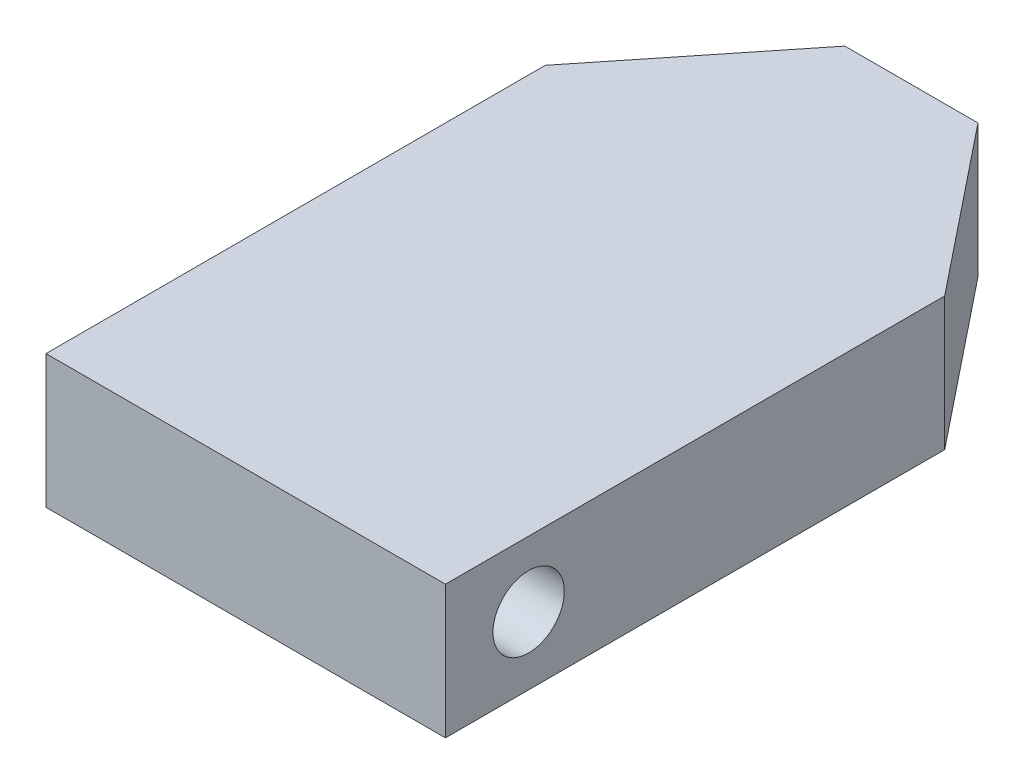
ISO-10303-21;
HEADER;
FILE_DESCRIPTION(('STEP AP214'),'2;1');
FILE_NAME('part.step','',(''),(''),'','','');
FILE_SCHEMA(('AUTOMOTIVE_DESIGN { 1 0 10303 214 1 1 1 1 }'));
ENDSEC;
DATA;
#1=APPLICATION_CONTEXT('core data for automotive mechanical design processes');
#2=APPLICATION_PROTOCOL_DEFINITION('international standard','automotive_design',2000,#1);
#3=PRODUCT_CONTEXT('',#1,'mechanical');
#4=PRODUCT('Part','Part','',(#3));
#5=PRODUCT_RELATED_PRODUCT_CATEGORY('part','',(#4));
#6=PRODUCT_DEFINITION_FORMATION('','',#4);
#7=PRODUCT_DEFINITION_CONTEXT('part definition',#1,'design');
#8=PRODUCT_DEFINITION('design','',#6,#7);
#9=PRODUCT_DEFINITION_SHAPE('','',#8);
#10=(LENGTH_UNIT() NAMED_UNIT(*) SI_UNIT(.MILLI.,.METRE.));
#11=(NAMED_UNIT(*) PLANE_ANGLE_UNIT() SI_UNIT($,.RADIAN.));
#12=(NAMED_UNIT(*) SI_UNIT($,.STERADIAN.) SOLID_ANGLE_UNIT());
#13=UNCERTAINTY_MEASURE_WITH_UNIT(LENGTH_MEASURE(1.E-05),#10,'distance_accuracy_value','');
#14=(GEOMETRIC_REPRESENTATION_CONTEXT(3) GLOBAL_UNCERTAINTY_ASSIGNED_CONTEXT((#13)) GLOBAL_UNIT_ASSIGNED_CONTEXT((#10,
#11,#12)) REPRESENTATION_CONTEXT('',''));
#15=CARTESIAN_POINT('',(0.,0.,0.));
#16=DIRECTION('',(0.,0.,1.));
#17=DIRECTION('',(1.,0.,0.));
#18=AXIS2_PLACEMENT_3D('',#15,#16,#17);
#19=CARTESIAN_POINT('',(-101.900826446281,40.,-53.4297520661157));
#20=DIRECTION('',(1.,0.,0.));
#21=DIRECTION('',(0.,0.,-1.));
#22=AXIS2_PLACEMENT_3D('',#19,#20,#21);
#23=PLANE('',#22);
#24=CARTESIAN_POINT('',(-101.900826446281,20.3232862042668,71.5726473236816));
#25=DIRECTION('',(-1.,0.,0.));
#26=DIRECTION('',(0.,0.,1.));
#27=AXIS2_PLACEMENT_3D('',#24,#25,#26);
#28=CIRCLE('',#27,10.7200240765857);
#29=CARTESIAN_POINT('',(-101.900826446281,20.3232862042668,82.2926714002673));
#30=VERTEX_POINT('',#29);
#31=EDGE_CURVE('E166',#30,#30,#28,.T.);
#32=ORIENTED_EDGE('',*,*,#31,.F.);
#33=EDGE_LOOP('',(#32));
#34=FACE_BOUND('',#33,.T.);
#35=DIRECTION('',(0.,0.,1.));
#36=VECTOR('',#35,1.);
#37=CARTESIAN_POINT('',(-101.900826446281,0.,-53.4297520661157));
#38=LINE('',#37,#36);
#39=CARTESIAN_POINT('',(-101.900826446281,0.,-53.4297520661157));
#40=VERTEX_POINT('',#39);
#41=CARTESIAN_POINT('',(-101.900826446281,0.,96.5702479338843));
#42=VERTEX_POINT('',#41);
#43=EDGE_CURVE('E125',#40,#42,#38,.T.);
#44=ORIENTED_EDGE('',*,*,#43,.T.);
#45=DIRECTION('',(0.,-1.,0.));
#46=VECTOR('',#45,1.);
#47=CARTESIAN_POINT('',(-101.900826446281,40.,96.5702479338843));
#48=LINE('',#47,#46);
#49=CARTESIAN_POINT('',(-101.900826446281,40.,96.5702479338843));
#50=VERTEX_POINT('',#49);
#51=EDGE_CURVE('E11',#50,#42,#48,.T.);
#52=ORIENTED_EDGE('',*,*,#51,.F.);
#53=DIRECTION('',(0.,0.,1.));
#54=VECTOR('',#53,1.);
#55=CARTESIAN_POINT('',(-101.900826446281,40.,-53.4297520661157));
#56=LINE('',#55,#54);
#57=CARTESIAN_POINT('',(-101.900826446281,40.,-53.4297520661157));
#58=VERTEX_POINT('',#57);
#59=EDGE_CURVE('E139',#58,#50,#56,.T.);
#60=ORIENTED_EDGE('',*,*,#59,.F.);
#61=DIRECTION('',(0.,-1.,0.));
#62=VECTOR('',#61,1.);
#63=CARTESIAN_POINT('',(-101.900826446281,40.,-53.4297520661157));
#64=LINE('',#63,#62);
#65=EDGE_CURVE('E57',#58,#40,#64,.T.);
#66=ORIENTED_EDGE('',*,*,#65,.T.);
#67=EDGE_LOOP('',(#44,#52,#60,#66));
#68=FACE_BOUND('',#67,.T.);
#69=ADVANCED_FACE('F41',(#34,#68),#23,.F.);
#70=CARTESIAN_POINT('',(-101.900826446281,40.,96.5702479338843));
#71=DIRECTION('',(0.,0.,-1.));
#72=DIRECTION('',(-1.,0.,0.));
#73=AXIS2_PLACEMENT_3D('',#70,#71,#72);
#74=PLANE('',#73);
#75=DIRECTION('',(1.,0.,0.));
#76=VECTOR('',#75,1.);
#77=CARTESIAN_POINT('',(-101.900826446281,0.,96.5702479338843));
#78=LINE('',#77,#76);
#79=CARTESIAN_POINT('',(18.099173553719,0.,96.5702479338843));
#80=VERTEX_POINT('',#79);
#81=EDGE_CURVE('E127',#42,#80,#78,.T.);
#82=ORIENTED_EDGE('',*,*,#81,.T.);
#83=DIRECTION('',(0.,-1.,0.));
#84=VECTOR('',#83,1.);
#85=CARTESIAN_POINT('',(18.099173553719,40.,96.5702479338843));
#86=LINE('',#85,#84);
#87=CARTESIAN_POINT('',(18.099173553719,40.,96.5702479338843));
#88=VERTEX_POINT('',#87);
#89=EDGE_CURVE('E49',#88,#80,#86,.T.);
#90=ORIENTED_EDGE('',*,*,#89,.F.);
#91=DIRECTION('',(1.,0.,0.));
#92=VECTOR('',#91,1.);
#93=CARTESIAN_POINT('',(-101.900826446281,40.,96.5702479338843));
#94=LINE('',#93,#92);
#95=EDGE_CURVE('E90',#50,#88,#94,.T.);
#96=ORIENTED_EDGE('',*,*,#95,.F.);
#97=ORIENTED_EDGE('',*,*,#51,.T.);
#98=EDGE_LOOP('',(#82,#90,#96,#97));
#99=FACE_BOUND('',#98,.T.);
#100=ADVANCED_FACE('F159',(#99),#74,.F.);
#101=CARTESIAN_POINT('',(18.099173553719,40.,96.5702479338843));
#102=DIRECTION('',(-1.,0.,0.));
#103=DIRECTION('',(0.,0.,1.));
#104=AXIS2_PLACEMENT_3D('',#101,#102,#103);
#105=PLANE('',#104);
#106=CARTESIAN_POINT('',(18.099173553719,20.3232862042668,71.5726473236816));
#107=DIRECTION('',(-1.,0.,0.));
#108=DIRECTION('',(0.,0.,1.));
#109=AXIS2_PLACEMENT_3D('',#106,#107,#108);
#110=CIRCLE('',#109,10.7200240765857);
#111=CARTESIAN_POINT('',(18.099173553719,20.3232862042668,82.2926714002673));
#112=VERTEX_POINT('',#111);
#113=EDGE_CURVE('E128',#112,#112,#110,.T.);
#114=ORIENTED_EDGE('',*,*,#113,.T.);
#115=EDGE_LOOP('',(#114));
#116=FACE_BOUND('',#115,.T.);
#117=DIRECTION('',(0.,0.,-1.));
#118=VECTOR('',#117,1.);
#119=CARTESIAN_POINT('',(18.099173553719,0.,96.5702479338843));
#120=LINE('',#119,#118);
#121=CARTESIAN_POINT('',(18.099173553719,0.,-53.4297520661157));
#122=VERTEX_POINT('',#121);
#123=EDGE_CURVE('E130',#80,#122,#120,.T.);
#124=ORIENTED_EDGE('',*,*,#123,.T.);
#125=DIRECTION('',(0.,-1.,0.));
#126=VECTOR('',#125,1.);
#127=CARTESIAN_POINT('',(18.099173553719,40.,-53.4297520661157));
#128=LINE('',#127,#126);
#129=CARTESIAN_POINT('',(18.099173553719,40.,-53.4297520661157));
#130=VERTEX_POINT('',#129);
#131=EDGE_CURVE('E109',#130,#122,#128,.T.);
#132=ORIENTED_EDGE('',*,*,#131,.F.);
#133=DIRECTION('',(0.,0.,-1.));
#134=VECTOR('',#133,1.);
#135=CARTESIAN_POINT('',(18.099173553719,40.,96.5702479338843));
#136=LINE('',#135,#134);
#137=EDGE_CURVE('E116',#88,#130,#136,.T.);
#138=ORIENTED_EDGE('',*,*,#137,.F.);
#139=ORIENTED_EDGE('',*,*,#89,.T.);
#140=EDGE_LOOP('',(#124,#132,#138,#139));
#141=FACE_BOUND('',#140,.T.);
#142=ADVANCED_FACE('F145',(#116,#141),#105,.F.);
#143=CARTESIAN_POINT('',(-21.900826446281,40.,-103.429752066116));
#144=DIRECTION('',(0.78086880944303,0.,-0.624695047554424));
#145=DIRECTION('',(-0.624695047554424,0.,-0.78086880944303));
#146=AXIS2_PLACEMENT_3D('',#143,#144,#145);
#147=PLANE('',#146);
#148=DIRECTION('',(0.624695047554424,0.,0.78086880944303));
#149=VECTOR('',#148,1.);
#150=CARTESIAN_POINT('',(-21.900826446281,0.,-103.429752066116));
#151=LINE('',#150,#149);
#152=CARTESIAN_POINT('',(-21.900826446281,0.,-103.429752066116));
#153=VERTEX_POINT('',#152);
#154=EDGE_CURVE('E106',#153,#122,#151,.T.);
#155=ORIENTED_EDGE('',*,*,#154,.F.);
#156=DIRECTION('',(0.,-1.,0.));
#157=VECTOR('',#156,1.);
#158=CARTESIAN_POINT('',(-21.900826446281,40.,-103.429752066116));
#159=LINE('',#158,#157);
#160=CARTESIAN_POINT('',(-21.900826446281,40.,-103.429752066116));
#161=VERTEX_POINT('',#160);
#162=EDGE_CURVE('E101',#161,#153,#159,.T.);
#163=ORIENTED_EDGE('',*,*,#162,.F.);
#164=DIRECTION('',(0.624695047554424,0.,0.78086880944303));
#165=VECTOR('',#164,1.);
#166=CARTESIAN_POINT('',(-21.900826446281,40.,-103.429752066116));
#167=LINE('',#166,#165);
#168=EDGE_CURVE('E104',#161,#130,#167,.T.);
#169=ORIENTED_EDGE('',*,*,#168,.T.);
#170=ORIENTED_EDGE('',*,*,#131,.T.);
#171=EDGE_LOOP('',(#155,#163,#169,#170));
#172=FACE_BOUND('',#171,.T.);
#173=ADVANCED_FACE('F103',(#172),#147,.T.);
#174=CARTESIAN_POINT('',(-41.900826446281,40.,-103.429752066116));
#175=DIRECTION('',(0.,0.,1.));
#176=DIRECTION('',(1.,0.,0.));
#177=AXIS2_PLACEMENT_3D('',#174,#175,#176);
#178=PLANE('',#177);
#179=DIRECTION('',(-1.,0.,0.));
#180=VECTOR('',#179,1.);
#181=CARTESIAN_POINT('',(-41.900826446281,0.,-103.429752066116));
#182=LINE('',#181,#180);
#183=CARTESIAN_POINT('',(-61.900826446281,0.,-103.429752066116));
#184=VERTEX_POINT('',#183);
#185=EDGE_CURVE('E134',#153,#184,#182,.T.);
#186=ORIENTED_EDGE('',*,*,#185,.T.);
#187=DIRECTION('',(0.,-1.,0.));
#188=VECTOR('',#187,1.);
#189=CARTESIAN_POINT('',(-61.900826446281,40.,-103.429752066116));
#190=LINE('',#189,#188);
#191=CARTESIAN_POINT('',(-61.900826446281,40.,-103.429752066116));
#192=VERTEX_POINT('',#191);
#193=EDGE_CURVE('E78',#192,#184,#190,.T.);
#194=ORIENTED_EDGE('',*,*,#193,.F.);
#195=DIRECTION('',(1.,0.,0.));
#196=VECTOR('',#195,1.);
#197=CARTESIAN_POINT('',(-41.900826446281,40.,-103.429752066116));
#198=LINE('',#197,#196);
#199=EDGE_CURVE('E114',#192,#161,#198,.T.);
#200=ORIENTED_EDGE('',*,*,#199,.T.);
#201=ORIENTED_EDGE('',*,*,#162,.T.);
#202=EDGE_LOOP('',(#186,#194,#200,#201));
#203=FACE_BOUND('',#202,.T.);
#204=ADVANCED_FACE('F119',(#203),#178,.F.);
#205=CARTESIAN_POINT('',(-101.900826446281,40.,-53.4297520661157));
#206=DIRECTION('',(-0.78086880944303,0.,-0.624695047554424));
#207=DIRECTION('',(-0.624695047554424,0.,0.78086880944303));
#208=AXIS2_PLACEMENT_3D('',#205,#206,#207);
#209=PLANE('',#208);
#210=DIRECTION('',(0.624695047554424,0.,-0.78086880944303));
#211=VECTOR('',#210,1.);
#212=CARTESIAN_POINT('',(-101.900826446281,0.,-53.4297520661157));
#213=LINE('',#212,#211);
#214=EDGE_CURVE('E136',#40,#184,#213,.T.);
#215=ORIENTED_EDGE('',*,*,#214,.F.);
#216=ORIENTED_EDGE('',*,*,#65,.F.);
#217=DIRECTION('',(0.624695047554424,0.,-0.78086880944303));
#218=VECTOR('',#217,1.);
#219=CARTESIAN_POINT('',(-101.900826446281,40.,-53.4297520661157));
#220=LINE('',#219,#218);
#221=EDGE_CURVE('E120',#58,#192,#220,.T.);
#222=ORIENTED_EDGE('',*,*,#221,.T.);
#223=ORIENTED_EDGE('',*,*,#193,.T.);
#224=EDGE_LOOP('',(#215,#216,#222,#223));
#225=FACE_BOUND('',#224,.T.);
#226=ADVANCED_FACE('F148',(#225),#209,.T.);
#227=CARTESIAN_POINT('',(0.,40.,0.));
#228=DIRECTION('',(0.,1.,0.));
#229=DIRECTION('',(0.,0.,1.));
#230=AXIS2_PLACEMENT_3D('',#227,#228,#229);
#231=PLANE('',#230);
#232=ORIENTED_EDGE('',*,*,#59,.T.);
#233=ORIENTED_EDGE('',*,*,#95,.T.);
#234=ORIENTED_EDGE('',*,*,#137,.T.);
#235=ORIENTED_EDGE('',*,*,#168,.F.);
#236=ORIENTED_EDGE('',*,*,#199,.F.);
#237=ORIENTED_EDGE('',*,*,#221,.F.);
#238=EDGE_LOOP('',(#232,#233,#234,#235,#236,#237));
#239=FACE_BOUND('',#238,.T.);
#240=ADVANCED_FACE('F112',(#239),#231,.T.);
#241=CARTESIAN_POINT('',(0.,0.,0.));
#242=DIRECTION('',(0.,1.,0.));
#243=DIRECTION('',(0.,0.,1.));
#244=AXIS2_PLACEMENT_3D('',#241,#242,#243);
#245=PLANE('',#244);
#246=ORIENTED_EDGE('',*,*,#43,.F.);
#247=ORIENTED_EDGE('',*,*,#214,.T.);
#248=ORIENTED_EDGE('',*,*,#185,.F.);
#249=ORIENTED_EDGE('',*,*,#154,.T.);
#250=ORIENTED_EDGE('',*,*,#123,.F.);
#251=ORIENTED_EDGE('',*,*,#81,.F.);
#252=EDGE_LOOP('',(#246,#247,#248,#249,#250,#251));
#253=FACE_BOUND('',#252,.T.);
#254=ADVANCED_FACE('F147',(#253),#245,.F.);
#255=CARTESIAN_POINT('',(18.099173553719,20.3232862042668,71.5726473236816));
#256=DIRECTION('',(-1.,0.,0.));
#257=DIRECTION('',(0.,0.,1.));
#258=AXIS2_PLACEMENT_3D('',#255,#256,#257);
#259=CYLINDRICAL_SURFACE('',#258,10.7200240765857);
#260=ORIENTED_EDGE('',*,*,#113,.F.);
#261=EDGE_LOOP('',(#260));
#262=FACE_BOUND('',#261,.T.);
#263=ORIENTED_EDGE('',*,*,#31,.T.);
#264=EDGE_LOOP('',(#263));
#265=FACE_BOUND('',#264,.T.);
#266=ADVANCED_FACE('F176',(#262,#265),#259,.F.);
#267=CLOSED_SHELL('',(#69,#100,#142,#173,#204,#226,#240,#254,#266));
#268=MANIFOLD_SOLID_BREP('B2',#267);
#269=ADVANCED_BREP_SHAPE_REPRESENTATION('',(#18,#268),#14);
#270=SHAPE_DEFINITION_REPRESENTATION(#9,#269);
ENDSEC;
END-ISO-10303-21;
